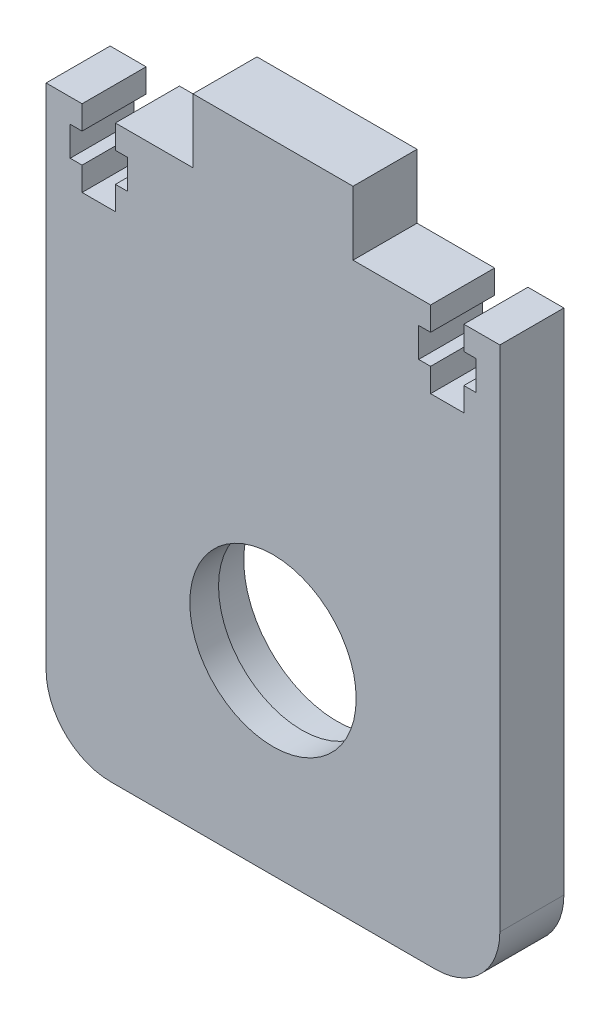
ISO-10303-21;
HEADER;
FILE_DESCRIPTION(('STEP AP214'),'2;1');
FILE_NAME('part.step','',(''),(''),'','','');
FILE_SCHEMA(('AUTOMOTIVE_DESIGN { 1 0 10303 214 1 1 1 1 }'));
ENDSEC;
DATA;
#1=APPLICATION_CONTEXT('core data for automotive mechanical design processes');
#2=APPLICATION_PROTOCOL_DEFINITION('international standard','automotive_design',2000,#1);
#3=PRODUCT_CONTEXT('',#1,'mechanical');
#4=PRODUCT('Part','Part','',(#3));
#5=PRODUCT_RELATED_PRODUCT_CATEGORY('part','',(#4));
#6=PRODUCT_DEFINITION_FORMATION('','',#4);
#7=PRODUCT_DEFINITION_CONTEXT('part definition',#1,'design');
#8=PRODUCT_DEFINITION('design','',#6,#7);
#9=PRODUCT_DEFINITION_SHAPE('','',#8);
#10=(LENGTH_UNIT() NAMED_UNIT(*) SI_UNIT(.MILLI.,.METRE.));
#11=(NAMED_UNIT(*) PLANE_ANGLE_UNIT() SI_UNIT($,.RADIAN.));
#12=(NAMED_UNIT(*) SI_UNIT($,.STERADIAN.) SOLID_ANGLE_UNIT());
#13=UNCERTAINTY_MEASURE_WITH_UNIT(LENGTH_MEASURE(1.E-05),#10,'distance_accuracy_value','');
#14=(GEOMETRIC_REPRESENTATION_CONTEXT(3) GLOBAL_UNCERTAINTY_ASSIGNED_CONTEXT((#13)) GLOBAL_UNIT_ASSIGNED_CONTEXT((#10,
#11,#12)) REPRESENTATION_CONTEXT('',''));
#15=CARTESIAN_POINT('',(0.,0.,0.));
#16=DIRECTION('',(0.,0.,1.));
#17=DIRECTION('',(1.,0.,0.));
#18=AXIS2_PLACEMENT_3D('',#15,#16,#17);
#19=CARTESIAN_POINT('',(62.1258493643405,113.63,12.7));
#20=DIRECTION('',(0.,1.,0.));
#21=DIRECTION('',(0.,0.,1.));
#22=AXIS2_PLACEMENT_3D('',#19,#20,#21);
#23=PLANE('',#22);
#24=DIRECTION('',(1.,0.,0.));
#25=VECTOR('',#24,1.);
#26=CARTESIAN_POINT('',(62.1258493643405,113.63,12.7));
#27=LINE('',#26,#25);
#28=CARTESIAN_POINT('',(75.8678493643405,113.63,12.7));
#29=VERTEX_POINT('',#28);
#30=CARTESIAN_POINT('',(91.2508493643405,113.63,12.7));
#31=VERTEX_POINT('',#30);
#32=EDGE_CURVE('E564',#29,#31,#27,.T.);
#33=ORIENTED_EDGE('',*,*,#32,.T.);
#34=DIRECTION('',(0.,0.,1.));
#35=VECTOR('',#34,1.);
#36=CARTESIAN_POINT('',(91.2508493643405,113.63,0.));
#37=LINE('',#36,#35);
#38=CARTESIAN_POINT('',(91.2508493643405,113.63,0.));
#39=VERTEX_POINT('',#38);
#40=EDGE_CURVE('E294',#39,#31,#37,.T.);
#41=ORIENTED_EDGE('',*,*,#40,.F.);
#42=DIRECTION('',(1.,0.,0.));
#43=VECTOR('',#42,1.);
#44=CARTESIAN_POINT('',(62.1258493643405,113.63,0.));
#45=LINE('',#44,#43);
#46=CARTESIAN_POINT('',(75.8678493643405,113.63,0.));
#47=VERTEX_POINT('',#46);
#48=EDGE_CURVE('E276',#47,#39,#45,.T.);
#49=ORIENTED_EDGE('',*,*,#48,.F.);
#50=DIRECTION('',(0.,0.,-1.));
#51=VECTOR('',#50,1.);
#52=CARTESIAN_POINT('',(75.8678493643405,113.63,12.7));
#53=LINE('',#52,#51);
#54=EDGE_CURVE('E382',#29,#47,#53,.T.);
#55=ORIENTED_EDGE('',*,*,#54,.F.);
#56=EDGE_LOOP('',(#33,#41,#49,#55));
#57=FACE_BOUND('',#56,.T.);
#58=ADVANCED_FACE('F39',(#57),#23,.T.);
#59=CARTESIAN_POINT('',(123.00084936434,113.63,0.));
#60=VERTEX_POINT('',#59);
#61=CARTESIAN_POINT('',(138.38384936434,113.63,0.));
#62=VERTEX_POINT('',#61);
#63=EDGE_CURVE('E582',#60,#62,#45,.T.);
#64=ORIENTED_EDGE('',*,*,#63,.F.);
#65=DIRECTION('',(0.,0.,-1.));
#66=VECTOR('',#65,1.);
#67=CARTESIAN_POINT('',(123.00084936434,113.63,12.7));
#68=LINE('',#67,#66);
#69=CARTESIAN_POINT('',(123.00084936434,113.63,12.7));
#70=VERTEX_POINT('',#69);
#71=EDGE_CURVE('E269',#70,#60,#68,.T.);
#72=ORIENTED_EDGE('',*,*,#71,.F.);
#73=CARTESIAN_POINT('',(138.38384936434,113.63,12.7));
#74=VERTEX_POINT('',#73);
#75=EDGE_CURVE('E565',#70,#74,#27,.T.);
#76=ORIENTED_EDGE('',*,*,#75,.T.);
#77=DIRECTION('',(0.,0.,-1.));
#78=VECTOR('',#77,1.);
#79=CARTESIAN_POINT('',(138.38384936434,113.63,12.7));
#80=LINE('',#79,#78);
#81=EDGE_CURVE('E344',#74,#62,#80,.T.);
#82=ORIENTED_EDGE('',*,*,#81,.T.);
#83=EDGE_LOOP('',(#64,#72,#76,#82));
#84=FACE_BOUND('',#83,.T.);
#85=ADVANCED_FACE('F758',(#84),#23,.T.);
#86=CARTESIAN_POINT('',(62.1258493643405,113.63,12.7));
#87=VERTEX_POINT('',#86);
#88=CARTESIAN_POINT('',(69.2638493643405,113.63,12.7));
#89=VERTEX_POINT('',#88);
#90=EDGE_CURVE('E559',#87,#89,#27,.T.);
#91=ORIENTED_EDGE('',*,*,#90,.T.);
#92=DIRECTION('',(0.,0.,-1.));
#93=VECTOR('',#92,1.);
#94=CARTESIAN_POINT('',(69.2638493643405,113.63,12.7));
#95=LINE('',#94,#93);
#96=CARTESIAN_POINT('',(69.2638493643405,113.63,0.));
#97=VERTEX_POINT('',#96);
#98=EDGE_CURVE('E386',#89,#97,#95,.T.);
#99=ORIENTED_EDGE('',*,*,#98,.T.);
#100=CARTESIAN_POINT('',(62.1258493643405,113.63,0.));
#101=VERTEX_POINT('',#100);
#102=EDGE_CURVE('E577',#101,#97,#45,.T.);
#103=ORIENTED_EDGE('',*,*,#102,.F.);
#104=DIRECTION('',(0.,0.,-1.));
#105=VECTOR('',#104,1.);
#106=CARTESIAN_POINT('',(62.1258493643405,113.63,12.7));
#107=LINE('',#106,#105);
#108=EDGE_CURVE('E573',#87,#101,#107,.T.);
#109=ORIENTED_EDGE('',*,*,#108,.F.);
#110=EDGE_LOOP('',(#91,#99,#103,#109));
#111=FACE_BOUND('',#110,.T.);
#112=ADVANCED_FACE('F650',(#111),#23,.T.);
#113=CARTESIAN_POINT('',(0.,0.,12.7));
#114=DIRECTION('',(0.,0.,-1.));
#115=DIRECTION('',(-1.,0.,0.));
#116=AXIS2_PLACEMENT_3D('',#113,#114,#115);
#117=PLANE('',#116);
#118=CARTESIAN_POINT('',(107.12584936434,38.6276036338558,12.7));
#119=DIRECTION('',(0.,0.,1.));
#120=DIRECTION('',(1.,0.,0.));
#121=AXIS2_PLACEMENT_3D('',#118,#119,#120);
#122=CIRCLE('',#121,16.5);
#123=CARTESIAN_POINT('',(123.62584936434,38.6276036338558,12.7));
#124=VERTEX_POINT('',#123);
#125=EDGE_CURVE('E385',#124,#124,#122,.T.);
#126=ORIENTED_EDGE('',*,*,#125,.F.);
#127=EDGE_LOOP('',(#126));
#128=FACE_BOUND('',#127,.T.);
#129=DIRECTION('',(0.,1.,0.));
#130=VECTOR('',#129,1.);
#131=CARTESIAN_POINT('',(75.8678493643392,-8.96257003544185E-13,12.7));
#132=LINE('',#131,#130);
#133=CARTESIAN_POINT('',(75.8678493643405,108.931,12.7));
#134=VERTEX_POINT('',#133);
#135=EDGE_CURVE('E306',#134,#29,#132,.T.);
#136=ORIENTED_EDGE('',*,*,#135,.F.);
#137=DIRECTION('',(-1.,0.,0.));
#138=VECTOR('',#137,1.);
#139=CARTESIAN_POINT('',(0.,108.931,12.7));
#140=LINE('',#139,#138);
#141=CARTESIAN_POINT('',(78.2298493643405,108.931,12.7));
#142=VERTEX_POINT('',#141);
#143=EDGE_CURVE('E309',#142,#134,#140,.T.);
#144=ORIENTED_EDGE('',*,*,#143,.F.);
#145=DIRECTION('',(0.,1.,0.));
#146=VECTOR('',#145,1.);
#147=CARTESIAN_POINT('',(78.2298493643405,0.,12.7));
#148=LINE('',#147,#146);
#149=CARTESIAN_POINT('',(78.2298493643405,103.089,12.7));
#150=VERTEX_POINT('',#149);
#151=EDGE_CURVE('E313',#150,#142,#148,.T.);
#152=ORIENTED_EDGE('',*,*,#151,.F.);
#153=DIRECTION('',(1.,0.,0.));
#154=VECTOR('',#153,1.);
#155=CARTESIAN_POINT('',(0.,103.089,12.7));
#156=LINE('',#155,#154);
#157=CARTESIAN_POINT('',(75.8678493643405,103.089,12.7));
#158=VERTEX_POINT('',#157);
#159=EDGE_CURVE('E316',#158,#150,#156,.T.);
#160=ORIENTED_EDGE('',*,*,#159,.F.);
#161=DIRECTION('',(0.,1.,0.));
#162=VECTOR('',#161,1.);
#163=CARTESIAN_POINT('',(75.8678493643405,0.,12.7));
#164=LINE('',#163,#162);
#165=CARTESIAN_POINT('',(75.8678493643405,98.39,12.7));
#166=VERTEX_POINT('',#165);
#167=EDGE_CURVE('E319',#166,#158,#164,.T.);
#168=ORIENTED_EDGE('',*,*,#167,.F.);
#169=DIRECTION('',(1.,0.,0.));
#170=VECTOR('',#169,1.);
#171=CARTESIAN_POINT('',(0.,98.39,12.7));
#172=LINE('',#171,#170);
#173=CARTESIAN_POINT('',(69.2638493643405,98.39,12.7));
#174=VERTEX_POINT('',#173);
#175=EDGE_CURVE('E322',#174,#166,#172,.T.);
#176=ORIENTED_EDGE('',*,*,#175,.F.);
#177=DIRECTION('',(0.,-1.,0.));
#178=VECTOR('',#177,1.);
#179=CARTESIAN_POINT('',(69.263849364339,-1.02280166442937E-12,12.7));
#180=LINE('',#179,#178);
#181=CARTESIAN_POINT('',(69.2638493643405,103.089,12.7));
#182=VERTEX_POINT('',#181);
#183=EDGE_CURVE('E325',#182,#174,#180,.T.);
#184=ORIENTED_EDGE('',*,*,#183,.F.);
#185=DIRECTION('',(1.,0.,0.));
#186=VECTOR('',#185,1.);
#187=CARTESIAN_POINT('',(0.,103.089,12.7));
#188=LINE('',#187,#186);
#189=CARTESIAN_POINT('',(66.9018493643405,103.089,12.7));
#190=VERTEX_POINT('',#189);
#191=EDGE_CURVE('E328',#190,#182,#188,.T.);
#192=ORIENTED_EDGE('',*,*,#191,.F.);
#193=DIRECTION('',(0.,-1.,0.));
#194=VECTOR('',#193,1.);
#195=CARTESIAN_POINT('',(66.9018493643405,0.,12.7));
#196=LINE('',#195,#194);
#197=CARTESIAN_POINT('',(66.9018493643405,108.931,12.7));
#198=VERTEX_POINT('',#197);
#199=EDGE_CURVE('E331',#198,#190,#196,.T.);
#200=ORIENTED_EDGE('',*,*,#199,.F.);
#201=DIRECTION('',(-1.,0.,0.));
#202=VECTOR('',#201,1.);
#203=CARTESIAN_POINT('',(0.,108.931,12.7));
#204=LINE('',#203,#202);
#205=CARTESIAN_POINT('',(69.2638493643405,108.931,12.7));
#206=VERTEX_POINT('',#205);
#207=EDGE_CURVE('E334',#206,#198,#204,.T.);
#208=ORIENTED_EDGE('',*,*,#207,.F.);
#209=DIRECTION('',(0.,-1.,0.));
#210=VECTOR('',#209,1.);
#211=CARTESIAN_POINT('',(69.2638493643415,6.13680998657644E-13,12.7));
#212=LINE('',#211,#210);
#213=EDGE_CURVE('E337',#89,#206,#212,.T.);
#214=ORIENTED_EDGE('',*,*,#213,.F.);
#215=ORIENTED_EDGE('',*,*,#90,.F.);
#216=DIRECTION('',(0.,1.,0.));
#217=VECTOR('',#216,1.);
#218=CARTESIAN_POINT('',(62.1258493643405,0.,12.7));
#219=LINE('',#218,#217);
#220=CARTESIAN_POINT('',(62.1258493643405,12.8,12.7));
#221=VERTEX_POINT('',#220);
#222=EDGE_CURVE('E554',#221,#87,#219,.T.);
#223=ORIENTED_EDGE('',*,*,#222,.F.);
#224=CARTESIAN_POINT('',(74.9258493643405,12.8,12.7));
#225=DIRECTION('',(0.,0.,-1.));
#226=DIRECTION('',(-1.,0.,0.));
#227=AXIS2_PLACEMENT_3D('',#224,#225,#226);
#228=CIRCLE('',#227,12.8);
#229=CARTESIAN_POINT('',(74.9258493643405,0.,12.7));
#230=VERTEX_POINT('',#229);
#231=EDGE_CURVE('E617',#221,#230,#228,.F.);
#232=ORIENTED_EDGE('',*,*,#231,.T.);
#233=DIRECTION('',(1.,0.,0.));
#234=VECTOR('',#233,1.);
#235=CARTESIAN_POINT('',(62.1258493643405,0.,12.7));
#236=LINE('',#235,#234);
#237=CARTESIAN_POINT('',(139.32584936434,0.,12.7));
#238=VERTEX_POINT('',#237);
#239=EDGE_CURVE('E569',#230,#238,#236,.T.);
#240=ORIENTED_EDGE('',*,*,#239,.T.);
#241=CARTESIAN_POINT('',(139.32584936434,12.8,12.7));
#242=DIRECTION('',(0.,0.,-1.));
#243=DIRECTION('',(-1.,0.,0.));
#244=AXIS2_PLACEMENT_3D('',#241,#242,#243);
#245=CIRCLE('',#244,12.8);
#246=CARTESIAN_POINT('',(152.12584936434,12.8,12.7));
#247=VERTEX_POINT('',#246);
#248=EDGE_CURVE('E48',#238,#247,#245,.F.);
#249=ORIENTED_EDGE('',*,*,#248,.T.);
#250=DIRECTION('',(0.,-1.,0.));
#251=VECTOR('',#250,1.);
#252=CARTESIAN_POINT('',(152.12584936434,113.63,12.7));
#253=LINE('',#252,#251);
#254=CARTESIAN_POINT('',(152.12584936434,113.63,12.7));
#255=VERTEX_POINT('',#254);
#256=EDGE_CURVE('E563',#255,#247,#253,.T.);
#257=ORIENTED_EDGE('',*,*,#256,.F.);
#258=CARTESIAN_POINT('',(144.98784936434,113.63,12.7));
#259=VERTEX_POINT('',#258);
#260=EDGE_CURVE('E557',#259,#255,#27,.T.);
#261=ORIENTED_EDGE('',*,*,#260,.F.);
#262=DIRECTION('',(0.,-1.,0.));
#263=VECTOR('',#262,1.);
#264=CARTESIAN_POINT('',(144.987849364339,-1.71279898547748E-12,12.7));
#265=LINE('',#264,#263);
#266=CARTESIAN_POINT('',(144.98784936434,108.931,12.7));
#267=VERTEX_POINT('',#266);
#268=EDGE_CURVE('E419',#259,#267,#265,.T.);
#269=ORIENTED_EDGE('',*,*,#268,.T.);
#270=DIRECTION('',(1.,0.,0.));
#271=VECTOR('',#270,1.);
#272=CARTESIAN_POINT('',(0.,108.931,12.7));
#273=LINE('',#272,#271);
#274=CARTESIAN_POINT('',(147.34984936434,108.931,12.7));
#275=VERTEX_POINT('',#274);
#276=EDGE_CURVE('E423',#267,#275,#273,.T.);
#277=ORIENTED_EDGE('',*,*,#276,.T.);
#278=DIRECTION('',(0.,-1.,0.));
#279=VECTOR('',#278,1.);
#280=CARTESIAN_POINT('',(147.34984936434,0.,12.7));
#281=LINE('',#280,#279);
#282=CARTESIAN_POINT('',(147.34984936434,103.089,12.7));
#283=VERTEX_POINT('',#282);
#284=EDGE_CURVE('E428',#275,#283,#281,.T.);
#285=ORIENTED_EDGE('',*,*,#284,.T.);
#286=DIRECTION('',(-1.,0.,0.));
#287=VECTOR('',#286,1.);
#288=CARTESIAN_POINT('',(0.,103.089,12.7));
#289=LINE('',#288,#287);
#290=CARTESIAN_POINT('',(144.98784936434,103.089,12.7));
#291=VERTEX_POINT('',#290);
#292=EDGE_CURVE('E432',#283,#291,#289,.T.);
#293=ORIENTED_EDGE('',*,*,#292,.T.);
#294=DIRECTION('',(0.,-1.,0.));
#295=VECTOR('',#294,1.);
#296=CARTESIAN_POINT('',(144.987849364341,8.5639949273875E-13,12.7));
#297=LINE('',#296,#295);
#298=CARTESIAN_POINT('',(144.98784936434,98.39,12.7));
#299=VERTEX_POINT('',#298);
#300=EDGE_CURVE('E436',#291,#299,#297,.T.);
#301=ORIENTED_EDGE('',*,*,#300,.T.);
#302=DIRECTION('',(-1.,0.,0.));
#303=VECTOR('',#302,1.);
#304=CARTESIAN_POINT('',(0.,98.39,12.7));
#305=LINE('',#304,#303);
#306=CARTESIAN_POINT('',(138.38384936434,98.39,12.7));
#307=VERTEX_POINT('',#306);
#308=EDGE_CURVE('E440',#299,#307,#305,.T.);
#309=ORIENTED_EDGE('',*,*,#308,.T.);
#310=DIRECTION('',(0.,1.,0.));
#311=VECTOR('',#310,1.);
#312=CARTESIAN_POINT('',(138.38384936434,-8.173916567384E-13,12.7));
#313=LINE('',#312,#311);
#314=CARTESIAN_POINT('',(138.383849364341,103.089,12.7));
#315=VERTEX_POINT('',#314);
#316=EDGE_CURVE('E444',#307,#315,#313,.T.);
#317=ORIENTED_EDGE('',*,*,#316,.T.);
#318=DIRECTION('',(-1.,0.,0.));
#319=VECTOR('',#318,1.);
#320=CARTESIAN_POINT('',(0.,103.089,12.7));
#321=LINE('',#320,#319);
#322=CARTESIAN_POINT('',(136.02184936434,103.089,12.7));
#323=VERTEX_POINT('',#322);
#324=EDGE_CURVE('E448',#315,#323,#321,.T.);
#325=ORIENTED_EDGE('',*,*,#324,.T.);
#326=DIRECTION('',(0.,1.,0.));
#327=VECTOR('',#326,1.);
#328=CARTESIAN_POINT('',(136.02184936434,0.,12.7));
#329=LINE('',#328,#327);
#330=CARTESIAN_POINT('',(136.02184936434,108.931,12.7));
#331=VERTEX_POINT('',#330);
#332=EDGE_CURVE('E452',#323,#331,#329,.T.);
#333=ORIENTED_EDGE('',*,*,#332,.T.);
#334=DIRECTION('',(1.,0.,0.));
#335=VECTOR('',#334,1.);
#336=CARTESIAN_POINT('',(0.,108.931,12.7));
#337=LINE('',#336,#335);
#338=CARTESIAN_POINT('',(138.38384936434,108.931,12.7));
#339=VERTEX_POINT('',#338);
#340=EDGE_CURVE('E456',#331,#339,#337,.T.);
#341=ORIENTED_EDGE('',*,*,#340,.T.);
#342=DIRECTION('',(0.,1.,0.));
#343=VECTOR('',#342,1.);
#344=CARTESIAN_POINT('',(138.383849364341,8.17391656738407E-13,12.7));
#345=LINE('',#344,#343);
#346=EDGE_CURVE('E460',#339,#74,#345,.T.);
#347=ORIENTED_EDGE('',*,*,#346,.T.);
#348=ORIENTED_EDGE('',*,*,#75,.F.);
#349=DIRECTION('',(0.,-1.,0.));
#350=VECTOR('',#349,1.);
#351=CARTESIAN_POINT('',(123.00084936434,126.33,12.7));
#352=LINE('',#351,#350);
#353=CARTESIAN_POINT('',(123.00084936434,126.33,12.7));
#354=VERTEX_POINT('',#353);
#355=EDGE_CURVE('E301',#354,#70,#352,.T.);
#356=ORIENTED_EDGE('',*,*,#355,.F.);
#357=DIRECTION('',(1.,0.,0.));
#358=VECTOR('',#357,1.);
#359=CARTESIAN_POINT('',(91.2508493643405,126.33,12.7));
#360=LINE('',#359,#358);
#361=CARTESIAN_POINT('',(91.2508493643405,126.33,12.7));
#362=VERTEX_POINT('',#361);
#363=EDGE_CURVE('E287',#362,#354,#360,.T.);
#364=ORIENTED_EDGE('',*,*,#363,.F.);
#365=DIRECTION('',(0.,-1.,0.));
#366=VECTOR('',#365,1.);
#367=CARTESIAN_POINT('',(91.2508493643405,126.33,12.7));
#368=LINE('',#367,#366);
#369=EDGE_CURVE('E281',#362,#31,#368,.T.);
#370=ORIENTED_EDGE('',*,*,#369,.T.);
#371=ORIENTED_EDGE('',*,*,#32,.F.);
#372=EDGE_LOOP('',(#136,#144,#152,#160,#168,#176,#184,#192,#200,#208,#214,#215,#223,#232,#240,
#249,#257,#261,#269,#277,#285,#293,#301,#309,#317,#325,#333,#341,#347,#348,#356,#364,#370,#371));
#373=FACE_BOUND('',#372,.T.);
#374=ADVANCED_FACE('F624',(#128,#373),#117,.F.);
#375=CARTESIAN_POINT('',(0.,0.,0.));
#376=DIRECTION('',(0.,0.,-1.));
#377=DIRECTION('',(-1.,0.,0.));
#378=AXIS2_PLACEMENT_3D('',#375,#376,#377);
#379=PLANE('',#378);
#380=CARTESIAN_POINT('',(107.12584936434,38.6276036338558,0.));
#381=DIRECTION('',(0.,0.,1.));
#382=DIRECTION('',(1.,0.,0.));
#383=AXIS2_PLACEMENT_3D('',#380,#381,#382);
#384=CIRCLE('',#383,18.5);
#385=CARTESIAN_POINT('',(125.62584936434,38.6276036338558,0.));
#386=VERTEX_POINT('',#385);
#387=EDGE_CURVE('E546',#386,#386,#384,.T.);
#388=ORIENTED_EDGE('',*,*,#387,.T.);
#389=EDGE_LOOP('',(#388));
#390=FACE_BOUND('',#389,.T.);
#391=DIRECTION('',(-1.,0.,0.));
#392=VECTOR('',#391,1.);
#393=CARTESIAN_POINT('',(0.,108.931,0.));
#394=LINE('',#393,#392);
#395=CARTESIAN_POINT('',(78.2298493643405,108.931,0.));
#396=VERTEX_POINT('',#395);
#397=CARTESIAN_POINT('',(75.8678493643405,108.931,0.));
#398=VERTEX_POINT('',#397);
#399=EDGE_CURVE('E343',#396,#398,#394,.T.);
#400=ORIENTED_EDGE('',*,*,#399,.T.);
#401=DIRECTION('',(0.,1.,0.));
#402=VECTOR('',#401,1.);
#403=CARTESIAN_POINT('',(75.8678493643392,-8.96257003544185E-13,0.));
#404=LINE('',#403,#402);
#405=EDGE_CURVE('E63',#398,#47,#404,.T.);
#406=ORIENTED_EDGE('',*,*,#405,.T.);
#407=ORIENTED_EDGE('',*,*,#48,.T.);
#408=DIRECTION('',(0.,-1.,0.));
#409=VECTOR('',#408,1.);
#410=CARTESIAN_POINT('',(91.2508493643405,126.33,0.));
#411=LINE('',#410,#409);
#412=CARTESIAN_POINT('',(91.2508493643405,126.33,0.));
#413=VERTEX_POINT('',#412);
#414=EDGE_CURVE('E272',#413,#39,#411,.T.);
#415=ORIENTED_EDGE('',*,*,#414,.F.);
#416=DIRECTION('',(-1.,0.,0.));
#417=VECTOR('',#416,1.);
#418=CARTESIAN_POINT('',(123.00084936434,126.33,0.));
#419=LINE('',#418,#417);
#420=CARTESIAN_POINT('',(123.00084936434,126.33,0.));
#421=VERTEX_POINT('',#420);
#422=EDGE_CURVE('E260',#421,#413,#419,.T.);
#423=ORIENTED_EDGE('',*,*,#422,.F.);
#424=DIRECTION('',(0.,-1.,0.));
#425=VECTOR('',#424,1.);
#426=CARTESIAN_POINT('',(123.00084936434,126.33,0.));
#427=LINE('',#426,#425);
#428=EDGE_CURVE('E55',#421,#60,#427,.T.);
#429=ORIENTED_EDGE('',*,*,#428,.T.);
#430=ORIENTED_EDGE('',*,*,#63,.T.);
#431=DIRECTION('',(0.,1.,0.));
#432=VECTOR('',#431,1.);
#433=CARTESIAN_POINT('',(138.383849364341,8.17391656738407E-13,0.));
#434=LINE('',#433,#432);
#435=CARTESIAN_POINT('',(138.38384936434,108.931,0.));
#436=VERTEX_POINT('',#435);
#437=EDGE_CURVE('E424',#436,#62,#434,.T.);
#438=ORIENTED_EDGE('',*,*,#437,.F.);
#439=DIRECTION('',(1.,0.,0.));
#440=VECTOR('',#439,1.);
#441=CARTESIAN_POINT('',(0.,108.931,0.));
#442=LINE('',#441,#440);
#443=CARTESIAN_POINT('',(136.02184936434,108.931,0.));
#444=VERTEX_POINT('',#443);
#445=EDGE_CURVE('E500',#444,#436,#442,.T.);
#446=ORIENTED_EDGE('',*,*,#445,.F.);
#447=DIRECTION('',(0.,1.,0.));
#448=VECTOR('',#447,1.);
#449=CARTESIAN_POINT('',(136.02184936434,0.,0.));
#450=LINE('',#449,#448);
#451=CARTESIAN_POINT('',(136.02184936434,103.089,0.));
#452=VERTEX_POINT('',#451);
#453=EDGE_CURVE('E496',#452,#444,#450,.T.);
#454=ORIENTED_EDGE('',*,*,#453,.F.);
#455=DIRECTION('',(-1.,0.,0.));
#456=VECTOR('',#455,1.);
#457=CARTESIAN_POINT('',(0.,103.089,0.));
#458=LINE('',#457,#456);
#459=CARTESIAN_POINT('',(138.383849364341,103.089,0.));
#460=VERTEX_POINT('',#459);
#461=EDGE_CURVE('E492',#460,#452,#458,.T.);
#462=ORIENTED_EDGE('',*,*,#461,.F.);
#463=DIRECTION('',(0.,1.,0.));
#464=VECTOR('',#463,1.);
#465=CARTESIAN_POINT('',(138.38384936434,-8.173916567384E-13,0.));
#466=LINE('',#465,#464);
#467=CARTESIAN_POINT('',(138.38384936434,98.39,0.));
#468=VERTEX_POINT('',#467);
#469=EDGE_CURVE('E488',#468,#460,#466,.T.);
#470=ORIENTED_EDGE('',*,*,#469,.F.);
#471=DIRECTION('',(-1.,0.,0.));
#472=VECTOR('',#471,1.);
#473=CARTESIAN_POINT('',(0.,98.39,0.));
#474=LINE('',#473,#472);
#475=CARTESIAN_POINT('',(144.98784936434,98.39,0.));
#476=VERTEX_POINT('',#475);
#477=EDGE_CURVE('E484',#476,#468,#474,.T.);
#478=ORIENTED_EDGE('',*,*,#477,.F.);
#479=DIRECTION('',(0.,-1.,0.));
#480=VECTOR('',#479,1.);
#481=CARTESIAN_POINT('',(144.987849364341,8.5639949273875E-13,0.));
#482=LINE('',#481,#480);
#483=CARTESIAN_POINT('',(144.98784936434,103.089,0.));
#484=VERTEX_POINT('',#483);
#485=EDGE_CURVE('E480',#484,#476,#482,.T.);
#486=ORIENTED_EDGE('',*,*,#485,.F.);
#487=DIRECTION('',(-1.,0.,0.));
#488=VECTOR('',#487,1.);
#489=CARTESIAN_POINT('',(0.,103.089,0.));
#490=LINE('',#489,#488);
#491=CARTESIAN_POINT('',(147.34984936434,103.089,0.));
#492=VERTEX_POINT('',#491);
#493=EDGE_CURVE('E476',#492,#484,#490,.T.);
#494=ORIENTED_EDGE('',*,*,#493,.F.);
#495=DIRECTION('',(0.,-1.,0.));
#496=VECTOR('',#495,1.);
#497=CARTESIAN_POINT('',(147.34984936434,0.,0.));
#498=LINE('',#497,#496);
#499=CARTESIAN_POINT('',(147.34984936434,108.931,0.));
#500=VERTEX_POINT('',#499);
#501=EDGE_CURVE('E472',#500,#492,#498,.T.);
#502=ORIENTED_EDGE('',*,*,#501,.F.);
#503=DIRECTION('',(1.,0.,0.));
#504=VECTOR('',#503,1.);
#505=CARTESIAN_POINT('',(0.,108.931,0.));
#506=LINE('',#505,#504);
#507=CARTESIAN_POINT('',(144.98784936434,108.931,0.));
#508=VERTEX_POINT('',#507);
#509=EDGE_CURVE('E468',#508,#500,#506,.T.);
#510=ORIENTED_EDGE('',*,*,#509,.F.);
#511=DIRECTION('',(0.,-1.,0.));
#512=VECTOR('',#511,1.);
#513=CARTESIAN_POINT('',(144.987849364339,-1.71279898547748E-12,0.));
#514=LINE('',#513,#512);
#515=CARTESIAN_POINT('',(144.98784936434,113.63,0.));
#516=VERTEX_POINT('',#515);
#517=EDGE_CURVE('E280',#516,#508,#514,.T.);
#518=ORIENTED_EDGE('',*,*,#517,.F.);
#519=CARTESIAN_POINT('',(152.12584936434,113.63,0.));
#520=VERTEX_POINT('',#519);
#521=EDGE_CURVE('E576',#516,#520,#45,.T.);
#522=ORIENTED_EDGE('',*,*,#521,.T.);
#523=DIRECTION('',(0.,-1.,0.));
#524=VECTOR('',#523,1.);
#525=CARTESIAN_POINT('',(152.12584936434,113.63,0.));
#526=LINE('',#525,#524);
#527=CARTESIAN_POINT('',(152.12584936434,12.8,0.));
#528=VERTEX_POINT('',#527);
#529=EDGE_CURVE('E581',#520,#528,#526,.T.);
#530=ORIENTED_EDGE('',*,*,#529,.T.);
#531=CARTESIAN_POINT('',(139.32584936434,12.8,0.));
#532=DIRECTION('',(0.,0.,-1.));
#533=DIRECTION('',(-1.,0.,0.));
#534=AXIS2_PLACEMENT_3D('',#531,#532,#533);
#535=CIRCLE('',#534,12.8);
#536=CARTESIAN_POINT('',(139.32584936434,0.,0.));
#537=VERTEX_POINT('',#536);
#538=EDGE_CURVE('E607',#528,#537,#535,.T.);
#539=ORIENTED_EDGE('',*,*,#538,.T.);
#540=DIRECTION('',(1.,0.,0.));
#541=VECTOR('',#540,1.);
#542=CARTESIAN_POINT('',(62.1258493643405,0.,0.));
#543=LINE('',#542,#541);
#544=CARTESIAN_POINT('',(74.9258493643405,0.,0.));
#545=VERTEX_POINT('',#544);
#546=EDGE_CURVE('E558',#545,#537,#543,.T.);
#547=ORIENTED_EDGE('',*,*,#546,.F.);
#548=CARTESIAN_POINT('',(74.9258493643405,12.8,0.));
#549=DIRECTION('',(0.,0.,-1.));
#550=DIRECTION('',(-1.,0.,0.));
#551=AXIS2_PLACEMENT_3D('',#548,#549,#550);
#552=CIRCLE('',#551,12.8);
#553=CARTESIAN_POINT('',(62.1258493643405,12.8,0.));
#554=VERTEX_POINT('',#553);
#555=EDGE_CURVE('E604',#545,#554,#552,.T.);
#556=ORIENTED_EDGE('',*,*,#555,.T.);
#557=DIRECTION('',(0.,1.,0.));
#558=VECTOR('',#557,1.);
#559=CARTESIAN_POINT('',(62.1258493643405,0.,0.));
#560=LINE('',#559,#558);
#561=EDGE_CURVE('E553',#554,#101,#560,.T.);
#562=ORIENTED_EDGE('',*,*,#561,.T.);
#563=ORIENTED_EDGE('',*,*,#102,.T.);
#564=DIRECTION('',(0.,-1.,0.));
#565=VECTOR('',#564,1.);
#566=CARTESIAN_POINT('',(69.2638493643415,6.13680998657644E-13,0.));
#567=LINE('',#566,#565);
#568=CARTESIAN_POINT('',(69.2638493643405,108.931,0.));
#569=VERTEX_POINT('',#568);
#570=EDGE_CURVE('E310',#97,#569,#567,.T.);
#571=ORIENTED_EDGE('',*,*,#570,.T.);
#572=DIRECTION('',(-1.,0.,0.));
#573=VECTOR('',#572,1.);
#574=CARTESIAN_POINT('',(0.,108.931,0.));
#575=LINE('',#574,#573);
#576=CARTESIAN_POINT('',(66.9018493643405,108.931,0.));
#577=VERTEX_POINT('',#576);
#578=EDGE_CURVE('E375',#569,#577,#575,.T.);
#579=ORIENTED_EDGE('',*,*,#578,.T.);
#580=DIRECTION('',(0.,-1.,0.));
#581=VECTOR('',#580,1.);
#582=CARTESIAN_POINT('',(66.9018493643405,0.,0.));
#583=LINE('',#582,#581);
#584=CARTESIAN_POINT('',(66.9018493643405,103.089,0.));
#585=VERTEX_POINT('',#584);
#586=EDGE_CURVE('E371',#577,#585,#583,.T.);
#587=ORIENTED_EDGE('',*,*,#586,.T.);
#588=DIRECTION('',(1.,0.,0.));
#589=VECTOR('',#588,1.);
#590=CARTESIAN_POINT('',(0.,103.089,0.));
#591=LINE('',#590,#589);
#592=CARTESIAN_POINT('',(69.2638493643405,103.089,0.));
#593=VERTEX_POINT('',#592);
#594=EDGE_CURVE('E367',#585,#593,#591,.T.);
#595=ORIENTED_EDGE('',*,*,#594,.T.);
#596=DIRECTION('',(0.,-1.,0.));
#597=VECTOR('',#596,1.);
#598=CARTESIAN_POINT('',(69.263849364339,-1.02280166442937E-12,0.));
#599=LINE('',#598,#597);
#600=CARTESIAN_POINT('',(69.2638493643405,98.39,0.));
#601=VERTEX_POINT('',#600);
#602=EDGE_CURVE('E363',#593,#601,#599,.T.);
#603=ORIENTED_EDGE('',*,*,#602,.T.);
#604=DIRECTION('',(1.,0.,0.));
#605=VECTOR('',#604,1.);
#606=CARTESIAN_POINT('',(0.,98.39,0.));
#607=LINE('',#606,#605);
#608=CARTESIAN_POINT('',(75.8678493643405,98.39,0.));
#609=VERTEX_POINT('',#608);
#610=EDGE_CURVE('E359',#601,#609,#607,.T.);
#611=ORIENTED_EDGE('',*,*,#610,.T.);
#612=DIRECTION('',(0.,1.,0.));
#613=VECTOR('',#612,1.);
#614=CARTESIAN_POINT('',(75.8678493643405,0.,0.));
#615=LINE('',#614,#613);
#616=CARTESIAN_POINT('',(75.8678493643405,103.089,0.));
#617=VERTEX_POINT('',#616);
#618=EDGE_CURVE('E355',#609,#617,#615,.T.);
#619=ORIENTED_EDGE('',*,*,#618,.T.);
#620=DIRECTION('',(1.,0.,0.));
#621=VECTOR('',#620,1.);
#622=CARTESIAN_POINT('',(0.,103.089,0.));
#623=LINE('',#622,#621);
#624=CARTESIAN_POINT('',(78.2298493643405,103.089,0.));
#625=VERTEX_POINT('',#624);
#626=EDGE_CURVE('E351',#617,#625,#623,.T.);
#627=ORIENTED_EDGE('',*,*,#626,.T.);
#628=DIRECTION('',(0.,1.,0.));
#629=VECTOR('',#628,1.);
#630=CARTESIAN_POINT('',(78.2298493643405,0.,0.));
#631=LINE('',#630,#629);
#632=EDGE_CURVE('E347',#625,#396,#631,.T.);
#633=ORIENTED_EDGE('',*,*,#632,.T.);
#634=EDGE_LOOP('',(#400,#406,#407,#415,#423,#429,#430,#438,#446,#454,#462,#470,#478,#486,#494,
#502,#510,#518,#522,#530,#539,#547,#556,#562,#563,#571,#579,#587,#595,#603,#611,#619,#627,#633));
#635=FACE_BOUND('',#634,.T.);
#636=ADVANCED_FACE('F274',(#390,#635),#379,.T.);
#637=CARTESIAN_POINT('',(107.12584936434,38.6276036338558,0.));
#638=DIRECTION('',(0.,0.,1.));
#639=DIRECTION('',(1.,0.,0.));
#640=AXIS2_PLACEMENT_3D('',#637,#638,#639);
#641=CYLINDRICAL_SURFACE('',#640,18.5);
#642=ORIENTED_EDGE('',*,*,#387,.F.);
#643=EDGE_LOOP('',(#642));
#644=FACE_BOUND('',#643,.T.);
#645=CARTESIAN_POINT('',(107.12584936434,38.6276036338558,7.));
#646=DIRECTION('',(0.,0.,1.));
#647=DIRECTION('',(1.,0.,0.));
#648=AXIS2_PLACEMENT_3D('',#645,#646,#647);
#649=CIRCLE('',#648,18.5);
#650=CARTESIAN_POINT('',(125.62584936434,38.6276036338558,7.));
#651=VERTEX_POINT('',#650);
#652=EDGE_CURVE('E593',#651,#651,#649,.F.);
#653=ORIENTED_EDGE('',*,*,#652,.F.);
#654=EDGE_LOOP('',(#653));
#655=FACE_BOUND('',#654,.T.);
#656=ADVANCED_FACE('F796',(#644,#655),#641,.F.);
#657=CARTESIAN_POINT('',(62.1258493643405,0.,12.7));
#658=DIRECTION('',(-1.,0.,0.));
#659=DIRECTION('',(0.,-1.,0.));
#660=AXIS2_PLACEMENT_3D('',#657,#658,#659);
#661=PLANE('',#660);
#662=ORIENTED_EDGE('',*,*,#561,.F.);
#663=DIRECTION('',(0.,0.,-1.));
#664=VECTOR('',#663,1.);
#665=CARTESIAN_POINT('',(62.1258493643405,12.8,12.7));
#666=LINE('',#665,#664);
#667=EDGE_CURVE('E11',#554,#221,#666,.F.);
#668=ORIENTED_EDGE('',*,*,#667,.T.);
#669=ORIENTED_EDGE('',*,*,#222,.T.);
#670=ORIENTED_EDGE('',*,*,#108,.T.);
#671=EDGE_LOOP('',(#662,#668,#669,#670));
#672=FACE_BOUND('',#671,.T.);
#673=ADVANCED_FACE('F644',(#672),#661,.T.);
#674=CARTESIAN_POINT('',(62.1258493643405,0.,12.7));
#675=DIRECTION('',(0.,1.,0.));
#676=DIRECTION('',(0.,0.,1.));
#677=AXIS2_PLACEMENT_3D('',#674,#675,#676);
#678=PLANE('',#677);
#679=ORIENTED_EDGE('',*,*,#546,.T.);
#680=DIRECTION('',(0.,0.,-1.));
#681=VECTOR('',#680,1.);
#682=CARTESIAN_POINT('',(139.32584936434,0.,12.7));
#683=LINE('',#682,#681);
#684=EDGE_CURVE('E614',#537,#238,#683,.F.);
#685=ORIENTED_EDGE('',*,*,#684,.T.);
#686=ORIENTED_EDGE('',*,*,#239,.F.);
#687=DIRECTION('',(0.,0.,-1.));
#688=VECTOR('',#687,1.);
#689=CARTESIAN_POINT('',(74.9258493643405,0.,0.));
#690=LINE('',#689,#688);
#691=EDGE_CURVE('E610',#230,#545,#690,.T.);
#692=ORIENTED_EDGE('',*,*,#691,.T.);
#693=EDGE_LOOP('',(#679,#685,#686,#692));
#694=FACE_BOUND('',#693,.T.);
#695=ADVANCED_FACE('F637',(#694),#678,.F.);
#696=CARTESIAN_POINT('',(152.12584936434,113.63,12.7));
#697=DIRECTION('',(1.,0.,0.));
#698=DIRECTION('',(0.,0.,-1.));
#699=AXIS2_PLACEMENT_3D('',#696,#697,#698);
#700=PLANE('',#699);
#701=ORIENTED_EDGE('',*,*,#256,.T.);
#702=DIRECTION('',(0.,0.,-1.));
#703=VECTOR('',#702,1.);
#704=CARTESIAN_POINT('',(152.12584936434,12.8,0.));
#705=LINE('',#704,#703);
#706=EDGE_CURVE('E600',#247,#528,#705,.T.);
#707=ORIENTED_EDGE('',*,*,#706,.T.);
#708=ORIENTED_EDGE('',*,*,#529,.F.);
#709=DIRECTION('',(0.,0.,-1.));
#710=VECTOR('',#709,1.);
#711=CARTESIAN_POINT('',(152.12584936434,113.63,12.7));
#712=LINE('',#711,#710);
#713=EDGE_CURVE('E589',#255,#520,#712,.T.);
#714=ORIENTED_EDGE('',*,*,#713,.F.);
#715=EDGE_LOOP('',(#701,#707,#708,#714));
#716=FACE_BOUND('',#715,.T.);
#717=ADVANCED_FACE('F632',(#716),#700,.T.);
#718=DIRECTION('',(0.,0.,-1.));
#719=VECTOR('',#718,1.);
#720=CARTESIAN_POINT('',(144.98784936434,113.63,12.7));
#721=LINE('',#720,#719);
#722=EDGE_CURVE('E464',#259,#516,#721,.T.);
#723=ORIENTED_EDGE('',*,*,#722,.F.);
#724=ORIENTED_EDGE('',*,*,#260,.T.);
#725=ORIENTED_EDGE('',*,*,#713,.T.);
#726=ORIENTED_EDGE('',*,*,#521,.F.);
#727=EDGE_LOOP('',(#723,#724,#725,#726));
#728=FACE_BOUND('',#727,.T.);
#729=ADVANCED_FACE('F709',(#728),#23,.T.);
#730=CARTESIAN_POINT('',(107.12584936434,38.6276036338558,7.));
#731=DIRECTION('',(0.,0.,1.));
#732=DIRECTION('',(1.,0.,0.));
#733=AXIS2_PLACEMENT_3D('',#730,#731,#732);
#734=PLANE('',#733);
#735=CARTESIAN_POINT('',(107.12584936434,38.6276036338558,7.));
#736=DIRECTION('',(0.,0.,1.));
#737=DIRECTION('',(1.,0.,0.));
#738=AXIS2_PLACEMENT_3D('',#735,#736,#737);
#739=CIRCLE('',#738,16.5);
#740=CARTESIAN_POINT('',(123.62584936434,38.6276036338558,7.));
#741=VERTEX_POINT('',#740);
#742=EDGE_CURVE('E542',#741,#741,#739,.T.);
#743=ORIENTED_EDGE('',*,*,#742,.T.);
#744=EDGE_LOOP('',(#743));
#745=FACE_BOUND('',#744,.T.);
#746=ORIENTED_EDGE('',*,*,#652,.T.);
#747=EDGE_LOOP('',(#746));
#748=FACE_BOUND('',#747,.T.);
#749=ADVANCED_FACE('F779',(#745,#748),#734,.F.);
#750=CARTESIAN_POINT('',(107.12584936434,38.6276036338558,7.));
#751=DIRECTION('',(0.,0.,1.));
#752=DIRECTION('',(1.,0.,0.));
#753=AXIS2_PLACEMENT_3D('',#750,#751,#752);
#754=CYLINDRICAL_SURFACE('',#753,16.5);
#755=ORIENTED_EDGE('',*,*,#742,.F.);
#756=EDGE_LOOP('',(#755));
#757=FACE_BOUND('',#756,.T.);
#758=ORIENTED_EDGE('',*,*,#125,.T.);
#759=EDGE_LOOP('',(#758));
#760=FACE_BOUND('',#759,.T.);
#761=ADVANCED_FACE('F784',(#757,#760),#754,.F.);
#762=CARTESIAN_POINT('',(139.32584936434,12.8,12.7));
#763=DIRECTION('',(0.,0.,1.));
#764=DIRECTION('',(1.,0.,0.));
#765=AXIS2_PLACEMENT_3D('',#762,#763,#764);
#766=CYLINDRICAL_SURFACE('',#765,12.8);
#767=ORIENTED_EDGE('',*,*,#248,.F.);
#768=ORIENTED_EDGE('',*,*,#684,.F.);
#769=ORIENTED_EDGE('',*,*,#538,.F.);
#770=ORIENTED_EDGE('',*,*,#706,.F.);
#771=EDGE_LOOP('',(#767,#768,#769,#770));
#772=FACE_BOUND('',#771,.T.);
#773=ADVANCED_FACE('F634',(#772),#766,.T.);
#774=CARTESIAN_POINT('',(74.9258493643405,12.8,12.7));
#775=DIRECTION('',(0.,0.,1.));
#776=DIRECTION('',(1.,0.,0.));
#777=AXIS2_PLACEMENT_3D('',#774,#775,#776);
#778=CYLINDRICAL_SURFACE('',#777,12.8);
#779=ORIENTED_EDGE('',*,*,#231,.F.);
#780=ORIENTED_EDGE('',*,*,#667,.F.);
#781=ORIENTED_EDGE('',*,*,#555,.F.);
#782=ORIENTED_EDGE('',*,*,#691,.F.);
#783=EDGE_LOOP('',(#779,#780,#781,#782));
#784=FACE_BOUND('',#783,.T.);
#785=ADVANCED_FACE('F41',(#784),#778,.T.);
#786=CARTESIAN_POINT('',(138.383849364341,8.17391656738407E-13,12.7));
#787=DIRECTION('',(-1.,0.,0.));
#788=DIRECTION('',(0.,-1.,0.));
#789=AXIS2_PLACEMENT_3D('',#786,#787,#788);
#790=PLANE('',#789);
#791=ORIENTED_EDGE('',*,*,#437,.T.);
#792=ORIENTED_EDGE('',*,*,#81,.F.);
#793=ORIENTED_EDGE('',*,*,#346,.F.);
#794=DIRECTION('',(0.,0.,-1.));
#795=VECTOR('',#794,1.);
#796=CARTESIAN_POINT('',(138.38384936434,108.931,12.7));
#797=LINE('',#796,#795);
#798=EDGE_CURVE('E510',#339,#436,#797,.T.);
#799=ORIENTED_EDGE('',*,*,#798,.T.);
#800=EDGE_LOOP('',(#791,#792,#793,#799));
#801=FACE_BOUND('',#800,.T.);
#802=ADVANCED_FACE('F755',(#801),#790,.F.);
#803=CARTESIAN_POINT('',(0.,108.931,12.7));
#804=DIRECTION('',(0.,1.,0.));
#805=DIRECTION('',(0.,0.,1.));
#806=AXIS2_PLACEMENT_3D('',#803,#804,#805);
#807=PLANE('',#806);
#808=ORIENTED_EDGE('',*,*,#445,.T.);
#809=ORIENTED_EDGE('',*,*,#798,.F.);
#810=ORIENTED_EDGE('',*,*,#340,.F.);
#811=DIRECTION('',(0.,0.,-1.));
#812=VECTOR('',#811,1.);
#813=CARTESIAN_POINT('',(136.02184936434,108.931,12.7));
#814=LINE('',#813,#812);
#815=EDGE_CURVE('E513',#331,#444,#814,.T.);
#816=ORIENTED_EDGE('',*,*,#815,.T.);
#817=EDGE_LOOP('',(#808,#809,#810,#816));
#818=FACE_BOUND('',#817,.T.);
#819=ADVANCED_FACE('F750',(#818),#807,.F.);
#820=CARTESIAN_POINT('',(136.02184936434,0.,12.7));
#821=DIRECTION('',(-1.,0.,0.));
#822=DIRECTION('',(0.,0.,1.));
#823=AXIS2_PLACEMENT_3D('',#820,#821,#822);
#824=PLANE('',#823);
#825=ORIENTED_EDGE('',*,*,#453,.T.);
#826=ORIENTED_EDGE('',*,*,#815,.F.);
#827=ORIENTED_EDGE('',*,*,#332,.F.);
#828=DIRECTION('',(0.,0.,-1.));
#829=VECTOR('',#828,1.);
#830=CARTESIAN_POINT('',(136.02184936434,103.089,12.7));
#831=LINE('',#830,#829);
#832=EDGE_CURVE('E516',#323,#452,#831,.T.);
#833=ORIENTED_EDGE('',*,*,#832,.T.);
#834=EDGE_LOOP('',(#825,#826,#827,#833));
#835=FACE_BOUND('',#834,.T.);
#836=ADVANCED_FACE('F745',(#835),#824,.F.);
#837=CARTESIAN_POINT('',(0.,103.089,12.7));
#838=DIRECTION('',(0.,-1.,0.));
#839=DIRECTION('',(0.,0.,-1.));
#840=AXIS2_PLACEMENT_3D('',#837,#838,#839);
#841=PLANE('',#840);
#842=ORIENTED_EDGE('',*,*,#461,.T.);
#843=ORIENTED_EDGE('',*,*,#832,.F.);
#844=ORIENTED_EDGE('',*,*,#324,.F.);
#845=DIRECTION('',(0.,0.,-1.));
#846=VECTOR('',#845,1.);
#847=CARTESIAN_POINT('',(138.383849364341,103.089,12.7));
#848=LINE('',#847,#846);
#849=EDGE_CURVE('E519',#315,#460,#848,.T.);
#850=ORIENTED_EDGE('',*,*,#849,.T.);
#851=EDGE_LOOP('',(#842,#843,#844,#850));
#852=FACE_BOUND('',#851,.T.);
#853=ADVANCED_FACE('F741',(#852),#841,.F.);
#854=CARTESIAN_POINT('',(138.38384936434,-8.173916567384E-13,12.7));
#855=DIRECTION('',(-1.,0.,0.));
#856=DIRECTION('',(0.,-1.,0.));
#857=AXIS2_PLACEMENT_3D('',#854,#855,#856);
#858=PLANE('',#857);
#859=ORIENTED_EDGE('',*,*,#469,.T.);
#860=ORIENTED_EDGE('',*,*,#849,.F.);
#861=ORIENTED_EDGE('',*,*,#316,.F.);
#862=DIRECTION('',(0.,0.,-1.));
#863=VECTOR('',#862,1.);
#864=CARTESIAN_POINT('',(138.38384936434,98.39,12.7));
#865=LINE('',#864,#863);
#866=EDGE_CURVE('E522',#307,#468,#865,.T.);
#867=ORIENTED_EDGE('',*,*,#866,.T.);
#868=EDGE_LOOP('',(#859,#860,#861,#867));
#869=FACE_BOUND('',#868,.T.);
#870=ADVANCED_FACE('F737',(#869),#858,.F.);
#871=CARTESIAN_POINT('',(0.,98.39,12.7));
#872=DIRECTION('',(0.,-1.,0.));
#873=DIRECTION('',(0.,0.,-1.));
#874=AXIS2_PLACEMENT_3D('',#871,#872,#873);
#875=PLANE('',#874);
#876=ORIENTED_EDGE('',*,*,#477,.T.);
#877=ORIENTED_EDGE('',*,*,#866,.F.);
#878=ORIENTED_EDGE('',*,*,#308,.F.);
#879=DIRECTION('',(0.,0.,-1.));
#880=VECTOR('',#879,1.);
#881=CARTESIAN_POINT('',(144.98784936434,98.39,12.7));
#882=LINE('',#881,#880);
#883=EDGE_CURVE('E525',#299,#476,#882,.T.);
#884=ORIENTED_EDGE('',*,*,#883,.T.);
#885=EDGE_LOOP('',(#876,#877,#878,#884));
#886=FACE_BOUND('',#885,.T.);
#887=ADVANCED_FACE('F733',(#886),#875,.F.);
#888=CARTESIAN_POINT('',(144.987849364341,8.5639949273875E-13,12.7));
#889=DIRECTION('',(1.,0.,0.));
#890=DIRECTION('',(0.,1.,0.));
#891=AXIS2_PLACEMENT_3D('',#888,#889,#890);
#892=PLANE('',#891);
#893=ORIENTED_EDGE('',*,*,#485,.T.);
#894=ORIENTED_EDGE('',*,*,#883,.F.);
#895=ORIENTED_EDGE('',*,*,#300,.F.);
#896=DIRECTION('',(0.,0.,-1.));
#897=VECTOR('',#896,1.);
#898=CARTESIAN_POINT('',(144.98784936434,103.089,12.7));
#899=LINE('',#898,#897);
#900=EDGE_CURVE('E528',#291,#484,#899,.T.);
#901=ORIENTED_EDGE('',*,*,#900,.T.);
#902=EDGE_LOOP('',(#893,#894,#895,#901));
#903=FACE_BOUND('',#902,.T.);
#904=ADVANCED_FACE('F729',(#903),#892,.F.);
#905=CARTESIAN_POINT('',(0.,103.089,12.7));
#906=DIRECTION('',(0.,-1.,0.));
#907=DIRECTION('',(0.,0.,-1.));
#908=AXIS2_PLACEMENT_3D('',#905,#906,#907);
#909=PLANE('',#908);
#910=ORIENTED_EDGE('',*,*,#493,.T.);
#911=ORIENTED_EDGE('',*,*,#900,.F.);
#912=ORIENTED_EDGE('',*,*,#292,.F.);
#913=DIRECTION('',(0.,0.,-1.));
#914=VECTOR('',#913,1.);
#915=CARTESIAN_POINT('',(147.34984936434,103.089,12.7));
#916=LINE('',#915,#914);
#917=EDGE_CURVE('E531',#283,#492,#916,.T.);
#918=ORIENTED_EDGE('',*,*,#917,.T.);
#919=EDGE_LOOP('',(#910,#911,#912,#918));
#920=FACE_BOUND('',#919,.T.);
#921=ADVANCED_FACE('F725',(#920),#909,.F.);
#922=CARTESIAN_POINT('',(147.34984936434,0.,12.7));
#923=DIRECTION('',(1.,0.,0.));
#924=DIRECTION('',(0.,0.,-1.));
#925=AXIS2_PLACEMENT_3D('',#922,#923,#924);
#926=PLANE('',#925);
#927=ORIENTED_EDGE('',*,*,#501,.T.);
#928=ORIENTED_EDGE('',*,*,#917,.F.);
#929=ORIENTED_EDGE('',*,*,#284,.F.);
#930=DIRECTION('',(0.,0.,-1.));
#931=VECTOR('',#930,1.);
#932=CARTESIAN_POINT('',(147.34984936434,108.931,12.7));
#933=LINE('',#932,#931);
#934=EDGE_CURVE('E534',#275,#500,#933,.T.);
#935=ORIENTED_EDGE('',*,*,#934,.T.);
#936=EDGE_LOOP('',(#927,#928,#929,#935));
#937=FACE_BOUND('',#936,.T.);
#938=ADVANCED_FACE('F721',(#937),#926,.F.);
#939=CARTESIAN_POINT('',(0.,108.931,12.7));
#940=DIRECTION('',(0.,1.,0.));
#941=DIRECTION('',(0.,0.,1.));
#942=AXIS2_PLACEMENT_3D('',#939,#940,#941);
#943=PLANE('',#942);
#944=ORIENTED_EDGE('',*,*,#509,.T.);
#945=ORIENTED_EDGE('',*,*,#934,.F.);
#946=ORIENTED_EDGE('',*,*,#276,.F.);
#947=DIRECTION('',(0.,0.,-1.));
#948=VECTOR('',#947,1.);
#949=CARTESIAN_POINT('',(144.98784936434,108.931,12.7));
#950=LINE('',#949,#948);
#951=EDGE_CURVE('E537',#267,#508,#950,.T.);
#952=ORIENTED_EDGE('',*,*,#951,.T.);
#953=EDGE_LOOP('',(#944,#945,#946,#952));
#954=FACE_BOUND('',#953,.T.);
#955=ADVANCED_FACE('F717',(#954),#943,.F.);
#956=CARTESIAN_POINT('',(144.987849364339,-1.71279898547748E-12,12.7));
#957=DIRECTION('',(1.,0.,0.));
#958=DIRECTION('',(0.,1.,0.));
#959=AXIS2_PLACEMENT_3D('',#956,#957,#958);
#960=PLANE('',#959);
#961=ORIENTED_EDGE('',*,*,#517,.T.);
#962=ORIENTED_EDGE('',*,*,#951,.F.);
#963=ORIENTED_EDGE('',*,*,#268,.F.);
#964=ORIENTED_EDGE('',*,*,#722,.T.);
#965=EDGE_LOOP('',(#961,#962,#963,#964));
#966=FACE_BOUND('',#965,.T.);
#967=ADVANCED_FACE('F713',(#966),#960,.F.);
#968=CARTESIAN_POINT('',(75.8678493643392,-8.96257003544185E-13,12.7));
#969=DIRECTION('',(-1.,0.,0.));
#970=DIRECTION('',(0.,-1.,0.));
#971=AXIS2_PLACEMENT_3D('',#968,#969,#970);
#972=PLANE('',#971);
#973=ORIENTED_EDGE('',*,*,#405,.F.);
#974=DIRECTION('',(0.,0.,-1.));
#975=VECTOR('',#974,1.);
#976=CARTESIAN_POINT('',(75.8678493643405,108.931,12.7));
#977=LINE('',#976,#975);
#978=EDGE_CURVE('E340',#134,#398,#977,.T.);
#979=ORIENTED_EDGE('',*,*,#978,.F.);
#980=ORIENTED_EDGE('',*,*,#135,.T.);
#981=ORIENTED_EDGE('',*,*,#54,.T.);
#982=EDGE_LOOP('',(#973,#979,#980,#981));
#983=FACE_BOUND('',#982,.T.);
#984=ADVANCED_FACE('F699',(#983),#972,.T.);
#985=CARTESIAN_POINT('',(69.2638493643415,6.13680998657644E-13,12.7));
#986=DIRECTION('',(1.,0.,0.));
#987=DIRECTION('',(0.,1.,0.));
#988=AXIS2_PLACEMENT_3D('',#985,#986,#987);
#989=PLANE('',#988);
#990=ORIENTED_EDGE('',*,*,#570,.F.);
#991=ORIENTED_EDGE('',*,*,#98,.F.);
#992=ORIENTED_EDGE('',*,*,#213,.T.);
#993=DIRECTION('',(0.,0.,-1.));
#994=VECTOR('',#993,1.);
#995=CARTESIAN_POINT('',(69.2638493643405,108.931,12.7));
#996=LINE('',#995,#994);
#997=EDGE_CURVE('E390',#206,#569,#996,.T.);
#998=ORIENTED_EDGE('',*,*,#997,.T.);
#999=EDGE_LOOP('',(#990,#991,#992,#998));
#1000=FACE_BOUND('',#999,.T.);
#1001=ADVANCED_FACE('F653',(#1000),#989,.T.);
#1002=CARTESIAN_POINT('',(0.,108.931,12.7));
#1003=DIRECTION('',(0.,-1.,0.));
#1004=DIRECTION('',(0.,0.,-1.));
#1005=AXIS2_PLACEMENT_3D('',#1002,#1003,#1004);
#1006=PLANE('',#1005);
#1007=ORIENTED_EDGE('',*,*,#578,.F.);
#1008=ORIENTED_EDGE('',*,*,#997,.F.);
#1009=ORIENTED_EDGE('',*,*,#207,.T.);
#1010=DIRECTION('',(0.,0.,-1.));
#1011=VECTOR('',#1010,1.);
#1012=CARTESIAN_POINT('',(66.9018493643405,108.931,12.7));
#1013=LINE('',#1012,#1011);
#1014=EDGE_CURVE('E393',#198,#577,#1013,.T.);
#1015=ORIENTED_EDGE('',*,*,#1014,.T.);
#1016=EDGE_LOOP('',(#1007,#1008,#1009,#1015));
#1017=FACE_BOUND('',#1016,.T.);
#1018=ADVANCED_FACE('F658',(#1017),#1006,.T.);
#1019=CARTESIAN_POINT('',(66.9018493643405,0.,12.7));
#1020=DIRECTION('',(1.,0.,0.));
#1021=DIRECTION('',(0.,0.,-1.));
#1022=AXIS2_PLACEMENT_3D('',#1019,#1020,#1021);
#1023=PLANE('',#1022);
#1024=ORIENTED_EDGE('',*,*,#586,.F.);
#1025=ORIENTED_EDGE('',*,*,#1014,.F.);
#1026=ORIENTED_EDGE('',*,*,#199,.T.);
#1027=DIRECTION('',(0.,0.,-1.));
#1028=VECTOR('',#1027,1.);
#1029=CARTESIAN_POINT('',(66.9018493643405,103.089,12.7));
#1030=LINE('',#1029,#1028);
#1031=EDGE_CURVE('E396',#190,#585,#1030,.T.);
#1032=ORIENTED_EDGE('',*,*,#1031,.T.);
#1033=EDGE_LOOP('',(#1024,#1025,#1026,#1032));
#1034=FACE_BOUND('',#1033,.T.);
#1035=ADVANCED_FACE('F663',(#1034),#1023,.T.);
#1036=CARTESIAN_POINT('',(0.,103.089,12.7));
#1037=DIRECTION('',(0.,1.,0.));
#1038=DIRECTION('',(0.,0.,1.));
#1039=AXIS2_PLACEMENT_3D('',#1036,#1037,#1038);
#1040=PLANE('',#1039);
#1041=ORIENTED_EDGE('',*,*,#594,.F.);
#1042=ORIENTED_EDGE('',*,*,#1031,.F.);
#1043=ORIENTED_EDGE('',*,*,#191,.T.);
#1044=DIRECTION('',(0.,0.,-1.));
#1045=VECTOR('',#1044,1.);
#1046=CARTESIAN_POINT('',(69.2638493643405,103.089,12.7));
#1047=LINE('',#1046,#1045);
#1048=EDGE_CURVE('E399',#182,#593,#1047,.T.);
#1049=ORIENTED_EDGE('',*,*,#1048,.T.);
#1050=EDGE_LOOP('',(#1041,#1042,#1043,#1049));
#1051=FACE_BOUND('',#1050,.T.);
#1052=ADVANCED_FACE('F668',(#1051),#1040,.T.);
#1053=CARTESIAN_POINT('',(69.263849364339,-1.02280166442937E-12,12.7));
#1054=DIRECTION('',(1.,0.,0.));
#1055=DIRECTION('',(0.,1.,0.));
#1056=AXIS2_PLACEMENT_3D('',#1053,#1054,#1055);
#1057=PLANE('',#1056);
#1058=ORIENTED_EDGE('',*,*,#602,.F.);
#1059=ORIENTED_EDGE('',*,*,#1048,.F.);
#1060=ORIENTED_EDGE('',*,*,#183,.T.);
#1061=DIRECTION('',(0.,0.,-1.));
#1062=VECTOR('',#1061,1.);
#1063=CARTESIAN_POINT('',(69.2638493643405,98.39,12.7));
#1064=LINE('',#1063,#1062);
#1065=EDGE_CURVE('E402',#174,#601,#1064,.T.);
#1066=ORIENTED_EDGE('',*,*,#1065,.T.);
#1067=EDGE_LOOP('',(#1058,#1059,#1060,#1066));
#1068=FACE_BOUND('',#1067,.T.);
#1069=ADVANCED_FACE('F673',(#1068),#1057,.T.);
#1070=CARTESIAN_POINT('',(0.,98.39,12.7));
#1071=DIRECTION('',(0.,1.,0.));
#1072=DIRECTION('',(0.,0.,1.));
#1073=AXIS2_PLACEMENT_3D('',#1070,#1071,#1072);
#1074=PLANE('',#1073);
#1075=ORIENTED_EDGE('',*,*,#610,.F.);
#1076=ORIENTED_EDGE('',*,*,#1065,.F.);
#1077=ORIENTED_EDGE('',*,*,#175,.T.);
#1078=DIRECTION('',(0.,0.,-1.));
#1079=VECTOR('',#1078,1.);
#1080=CARTESIAN_POINT('',(75.8678493643405,98.39,12.7));
#1081=LINE('',#1080,#1079);
#1082=EDGE_CURVE('E405',#166,#609,#1081,.T.);
#1083=ORIENTED_EDGE('',*,*,#1082,.T.);
#1084=EDGE_LOOP('',(#1075,#1076,#1077,#1083));
#1085=FACE_BOUND('',#1084,.T.);
#1086=ADVANCED_FACE('F678',(#1085),#1074,.T.);
#1087=CARTESIAN_POINT('',(75.8678493643405,0.,12.7));
#1088=DIRECTION('',(-1.,0.,0.));
#1089=DIRECTION('',(0.,0.,1.));
#1090=AXIS2_PLACEMENT_3D('',#1087,#1088,#1089);
#1091=PLANE('',#1090);
#1092=ORIENTED_EDGE('',*,*,#618,.F.);
#1093=ORIENTED_EDGE('',*,*,#1082,.F.);
#1094=ORIENTED_EDGE('',*,*,#167,.T.);
#1095=DIRECTION('',(0.,0.,-1.));
#1096=VECTOR('',#1095,1.);
#1097=CARTESIAN_POINT('',(75.8678493643405,103.089,12.7));
#1098=LINE('',#1097,#1096);
#1099=EDGE_CURVE('E408',#158,#617,#1098,.T.);
#1100=ORIENTED_EDGE('',*,*,#1099,.T.);
#1101=EDGE_LOOP('',(#1092,#1093,#1094,#1100));
#1102=FACE_BOUND('',#1101,.T.);
#1103=ADVANCED_FACE('F683',(#1102),#1091,.T.);
#1104=CARTESIAN_POINT('',(0.,103.089,12.7));
#1105=DIRECTION('',(0.,1.,0.));
#1106=DIRECTION('',(0.,0.,1.));
#1107=AXIS2_PLACEMENT_3D('',#1104,#1105,#1106);
#1108=PLANE('',#1107);
#1109=ORIENTED_EDGE('',*,*,#626,.F.);
#1110=ORIENTED_EDGE('',*,*,#1099,.F.);
#1111=ORIENTED_EDGE('',*,*,#159,.T.);
#1112=DIRECTION('',(0.,0.,-1.));
#1113=VECTOR('',#1112,1.);
#1114=CARTESIAN_POINT('',(78.2298493643405,103.089,12.7));
#1115=LINE('',#1114,#1113);
#1116=EDGE_CURVE('E411',#150,#625,#1115,.T.);
#1117=ORIENTED_EDGE('',*,*,#1116,.T.);
#1118=EDGE_LOOP('',(#1109,#1110,#1111,#1117));
#1119=FACE_BOUND('',#1118,.T.);
#1120=ADVANCED_FACE('F688',(#1119),#1108,.T.);
#1121=CARTESIAN_POINT('',(78.2298493643405,0.,12.7));
#1122=DIRECTION('',(-1.,0.,0.));
#1123=DIRECTION('',(0.,0.,1.));
#1124=AXIS2_PLACEMENT_3D('',#1121,#1122,#1123);
#1125=PLANE('',#1124);
#1126=ORIENTED_EDGE('',*,*,#632,.F.);
#1127=ORIENTED_EDGE('',*,*,#1116,.F.);
#1128=ORIENTED_EDGE('',*,*,#151,.T.);
#1129=DIRECTION('',(0.,0.,-1.));
#1130=VECTOR('',#1129,1.);
#1131=CARTESIAN_POINT('',(78.2298493643405,108.931,12.7));
#1132=LINE('',#1131,#1130);
#1133=EDGE_CURVE('E414',#142,#396,#1132,.T.);
#1134=ORIENTED_EDGE('',*,*,#1133,.T.);
#1135=EDGE_LOOP('',(#1126,#1127,#1128,#1134));
#1136=FACE_BOUND('',#1135,.T.);
#1137=ADVANCED_FACE('F693',(#1136),#1125,.T.);
#1138=CARTESIAN_POINT('',(0.,108.931,12.7));
#1139=DIRECTION('',(0.,-1.,0.));
#1140=DIRECTION('',(0.,0.,-1.));
#1141=AXIS2_PLACEMENT_3D('',#1138,#1139,#1140);
#1142=PLANE('',#1141);
#1143=ORIENTED_EDGE('',*,*,#399,.F.);
#1144=ORIENTED_EDGE('',*,*,#1133,.F.);
#1145=ORIENTED_EDGE('',*,*,#143,.T.);
#1146=ORIENTED_EDGE('',*,*,#978,.T.);
#1147=EDGE_LOOP('',(#1143,#1144,#1145,#1146));
#1148=FACE_BOUND('',#1147,.T.);
#1149=ADVANCED_FACE('F697',(#1148),#1142,.T.);
#1150=CARTESIAN_POINT('',(91.2508493643405,126.33,0.));
#1151=DIRECTION('',(1.,0.,0.));
#1152=DIRECTION('',(0.,0.,-1.));
#1153=AXIS2_PLACEMENT_3D('',#1150,#1151,#1152);
#1154=PLANE('',#1153);
#1155=ORIENTED_EDGE('',*,*,#40,.T.);
#1156=ORIENTED_EDGE('',*,*,#369,.F.);
#1157=DIRECTION('',(0.,0.,1.));
#1158=VECTOR('',#1157,1.);
#1159=CARTESIAN_POINT('',(91.2508493643405,126.33,0.));
#1160=LINE('',#1159,#1158);
#1161=EDGE_CURVE('E264',#413,#362,#1160,.T.);
#1162=ORIENTED_EDGE('',*,*,#1161,.F.);
#1163=ORIENTED_EDGE('',*,*,#414,.T.);
#1164=EDGE_LOOP('',(#1155,#1156,#1162,#1163));
#1165=FACE_BOUND('',#1164,.T.);
#1166=ADVANCED_FACE('F283',(#1165),#1154,.F.);
#1167=CARTESIAN_POINT('',(123.00084936434,126.33,12.7));
#1168=DIRECTION('',(-1.,0.,0.));
#1169=DIRECTION('',(0.,0.,1.));
#1170=AXIS2_PLACEMENT_3D('',#1167,#1168,#1169);
#1171=PLANE('',#1170);
#1172=ORIENTED_EDGE('',*,*,#71,.T.);
#1173=ORIENTED_EDGE('',*,*,#428,.F.);
#1174=DIRECTION('',(0.,0.,-1.));
#1175=VECTOR('',#1174,1.);
#1176=CARTESIAN_POINT('',(123.00084936434,126.33,12.7));
#1177=LINE('',#1176,#1175);
#1178=EDGE_CURVE('E267',#354,#421,#1177,.T.);
#1179=ORIENTED_EDGE('',*,*,#1178,.F.);
#1180=ORIENTED_EDGE('',*,*,#355,.T.);
#1181=EDGE_LOOP('',(#1172,#1173,#1179,#1180));
#1182=FACE_BOUND('',#1181,.T.);
#1183=ADVANCED_FACE('F762',(#1182),#1171,.F.);
#1184=CARTESIAN_POINT('',(0.,126.33,0.));
#1185=DIRECTION('',(0.,1.,0.));
#1186=DIRECTION('',(0.,0.,1.));
#1187=AXIS2_PLACEMENT_3D('',#1184,#1185,#1186);
#1188=PLANE('',#1187);
#1189=ORIENTED_EDGE('',*,*,#422,.T.);
#1190=ORIENTED_EDGE('',*,*,#1161,.T.);
#1191=ORIENTED_EDGE('',*,*,#363,.T.);
#1192=ORIENTED_EDGE('',*,*,#1178,.T.);
#1193=EDGE_LOOP('',(#1189,#1190,#1191,#1192));
#1194=FACE_BOUND('',#1193,.T.);
#1195=ADVANCED_FACE('F262',(#1194),#1188,.T.);
#1196=CLOSED_SHELL('',(#58,#85,#112,#374,#636,#656,#673,#695,#717,#729,#749,#761,#773,#785,#802,
#819,#836,#853,#870,#887,#904,#921,#938,#955,#967,#984,#1001,#1018,#1035,#1052,#1069,#1086,
#1103,#1120,#1137,#1149,#1166,#1183,#1195));
#1197=MANIFOLD_SOLID_BREP('B2',#1196);
#1198=ADVANCED_BREP_SHAPE_REPRESENTATION('',(#18,#1197),#14);
#1199=SHAPE_DEFINITION_REPRESENTATION(#9,#1198);
ENDSEC;
END-ISO-10303-21;
